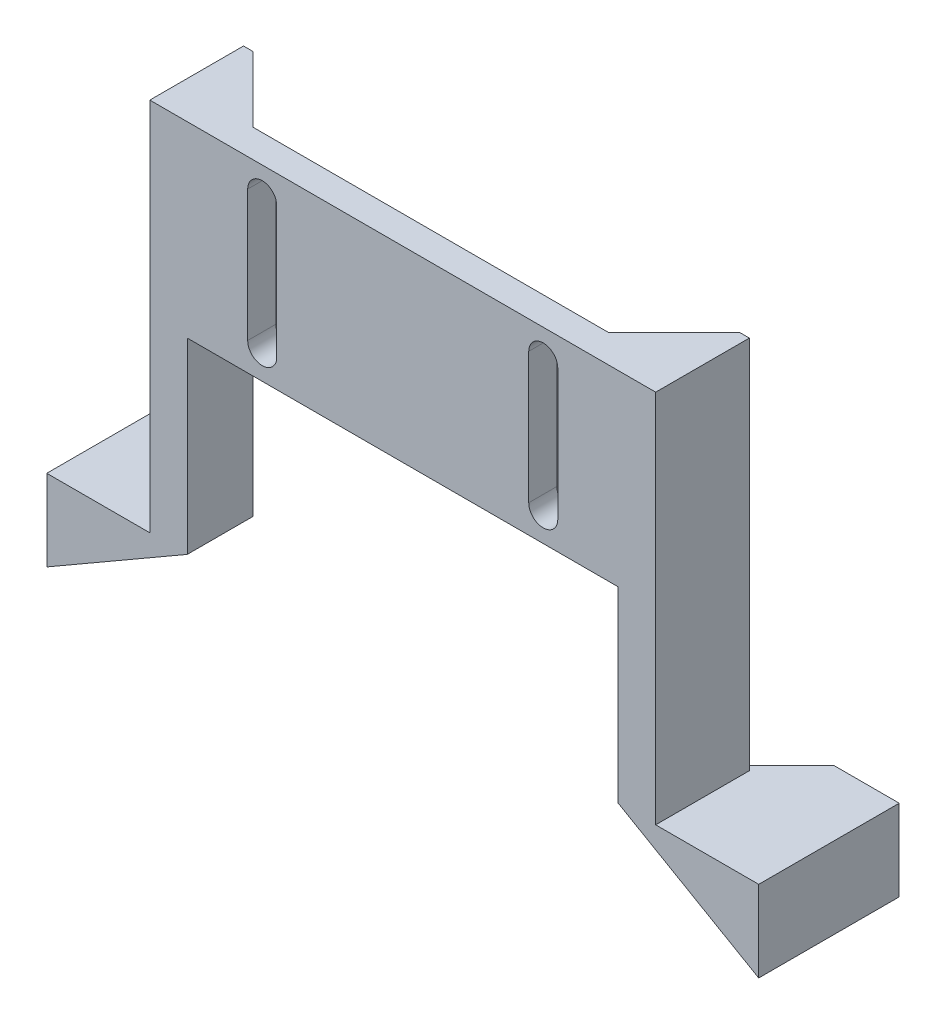
ISO-10303-21;
HEADER;
FILE_DESCRIPTION(('STEP AP214'),'2;1');
FILE_NAME('part.step','',(''),(''),'','','');
FILE_SCHEMA(('AUTOMOTIVE_DESIGN { 1 0 10303 214 1 1 1 1 }'));
ENDSEC;
DATA;
#1=APPLICATION_CONTEXT('core data for automotive mechanical design processes');
#2=APPLICATION_PROTOCOL_DEFINITION('international standard','automotive_design',2000,#1);
#3=PRODUCT_CONTEXT('',#1,'mechanical');
#4=PRODUCT('Part','Part','',(#3));
#5=PRODUCT_RELATED_PRODUCT_CATEGORY('part','',(#4));
#6=PRODUCT_DEFINITION_FORMATION('','',#4);
#7=PRODUCT_DEFINITION_CONTEXT('part definition',#1,'design');
#8=PRODUCT_DEFINITION('design','',#6,#7);
#9=PRODUCT_DEFINITION_SHAPE('','',#8);
#10=(LENGTH_UNIT() NAMED_UNIT(*) SI_UNIT(.MILLI.,.METRE.));
#11=(NAMED_UNIT(*) PLANE_ANGLE_UNIT() SI_UNIT($,.RADIAN.));
#12=(NAMED_UNIT(*) SI_UNIT($,.STERADIAN.) SOLID_ANGLE_UNIT());
#13=UNCERTAINTY_MEASURE_WITH_UNIT(LENGTH_MEASURE(1.E-05),#10,'distance_accuracy_value','');
#14=(GEOMETRIC_REPRESENTATION_CONTEXT(3) GLOBAL_UNCERTAINTY_ASSIGNED_CONTEXT((#13)) GLOBAL_UNIT_ASSIGNED_CONTEXT((#10,
#11,#12)) REPRESENTATION_CONTEXT('',''));
#15=CARTESIAN_POINT('',(0.,0.,0.));
#16=DIRECTION('',(0.,0.,1.));
#17=DIRECTION('',(1.,0.,0.));
#18=AXIS2_PLACEMENT_3D('',#15,#16,#17);
#19=CARTESIAN_POINT('',(-15.,-7.,10.));
#20=DIRECTION('',(0.,0.,-1.));
#21=DIRECTION('',(-1.,0.,0.));
#22=AXIS2_PLACEMENT_3D('',#19,#20,#21);
#23=CYLINDRICAL_SURFACE('',#22,1.55);
#24=DIRECTION('',(0.,0.,-1.));
#25=VECTOR('',#24,1.);
#26=CARTESIAN_POINT('',(-13.45,-7.,10.));
#27=LINE('',#26,#25);
#28=CARTESIAN_POINT('',(-13.45,-7.,10.));
#29=VERTEX_POINT('',#28);
#30=CARTESIAN_POINT('',(-13.45,-7.,7.));
#31=VERTEX_POINT('',#30);
#32=EDGE_CURVE('E348',#29,#31,#27,.T.);
#33=ORIENTED_EDGE('',*,*,#32,.T.);
#34=CARTESIAN_POINT('',(-15.,-7.,7.));
#35=DIRECTION('',(0.,0.,-1.));
#36=DIRECTION('',(-1.,0.,0.));
#37=AXIS2_PLACEMENT_3D('',#34,#35,#36);
#38=CIRCLE('',#37,1.55);
#39=CARTESIAN_POINT('',(-16.55,-7.,7.));
#40=VERTEX_POINT('',#39);
#41=EDGE_CURVE('E243',#31,#40,#38,.T.);
#42=ORIENTED_EDGE('',*,*,#41,.T.);
#43=DIRECTION('',(0.,0.,-1.));
#44=VECTOR('',#43,1.);
#45=CARTESIAN_POINT('',(-16.55,-7.,10.));
#46=LINE('',#45,#44);
#47=CARTESIAN_POINT('',(-16.55,-7.,10.));
#48=VERTEX_POINT('',#47);
#49=EDGE_CURVE('E358',#48,#40,#46,.T.);
#50=ORIENTED_EDGE('',*,*,#49,.F.);
#51=CARTESIAN_POINT('',(-15.,-7.,10.));
#52=DIRECTION('',(0.,0.,1.));
#53=DIRECTION('',(1.,0.,0.));
#54=AXIS2_PLACEMENT_3D('',#51,#52,#53);
#55=CIRCLE('',#54,1.55);
#56=EDGE_CURVE('E324',#48,#29,#55,.T.);
#57=ORIENTED_EDGE('',*,*,#56,.T.);
#58=EDGE_LOOP('',(#33,#42,#50,#57));
#59=FACE_BOUND('',#58,.T.);
#60=ADVANCED_FACE('F34',(#59),#23,.F.);
#61=CARTESIAN_POINT('',(-16.55,0.,10.));
#62=DIRECTION('',(1.,0.,0.));
#63=DIRECTION('',(0.,1.,0.));
#64=AXIS2_PLACEMENT_3D('',#61,#62,#63);
#65=PLANE('',#64);
#66=ORIENTED_EDGE('',*,*,#49,.T.);
#67=DIRECTION('',(0.,1.,0.));
#68=VECTOR('',#67,1.);
#69=CARTESIAN_POINT('',(-16.55,0.,7.));
#70=LINE('',#69,#68);
#71=CARTESIAN_POINT('',(-16.55,7.,7.));
#72=VERTEX_POINT('',#71);
#73=EDGE_CURVE('E240',#40,#72,#70,.T.);
#74=ORIENTED_EDGE('',*,*,#73,.T.);
#75=DIRECTION('',(0.,0.,-1.));
#76=VECTOR('',#75,1.);
#77=CARTESIAN_POINT('',(-16.55,7.,10.));
#78=LINE('',#77,#76);
#79=CARTESIAN_POINT('',(-16.55,7.,10.));
#80=VERTEX_POINT('',#79);
#81=EDGE_CURVE('E355',#80,#72,#78,.T.);
#82=ORIENTED_EDGE('',*,*,#81,.F.);
#83=DIRECTION('',(0.,-1.,0.));
#84=VECTOR('',#83,1.);
#85=CARTESIAN_POINT('',(-16.55,0.,10.));
#86=LINE('',#85,#84);
#87=EDGE_CURVE('E327',#80,#48,#86,.T.);
#88=ORIENTED_EDGE('',*,*,#87,.T.);
#89=EDGE_LOOP('',(#66,#74,#82,#88));
#90=FACE_BOUND('',#89,.T.);
#91=ADVANCED_FACE('F451',(#90),#65,.T.);
#92=CARTESIAN_POINT('',(-15.,7.,10.));
#93=DIRECTION('',(0.,0.,-1.));
#94=DIRECTION('',(-1.,0.,0.));
#95=AXIS2_PLACEMENT_3D('',#92,#93,#94);
#96=CYLINDRICAL_SURFACE('',#95,1.55);
#97=ORIENTED_EDGE('',*,*,#81,.T.);
#98=CARTESIAN_POINT('',(-15.,7.,7.));
#99=DIRECTION('',(0.,0.,-1.));
#100=DIRECTION('',(-1.,0.,0.));
#101=AXIS2_PLACEMENT_3D('',#98,#99,#100);
#102=CIRCLE('',#101,1.55);
#103=CARTESIAN_POINT('',(-13.45,7.,7.));
#104=VERTEX_POINT('',#103);
#105=EDGE_CURVE('E237',#72,#104,#102,.T.);
#106=ORIENTED_EDGE('',*,*,#105,.T.);
#107=DIRECTION('',(0.,0.,-1.));
#108=VECTOR('',#107,1.);
#109=CARTESIAN_POINT('',(-13.45,7.,10.));
#110=LINE('',#109,#108);
#111=CARTESIAN_POINT('',(-13.45,7.,10.));
#112=VERTEX_POINT('',#111);
#113=EDGE_CURVE('E351',#112,#104,#110,.T.);
#114=ORIENTED_EDGE('',*,*,#113,.F.);
#115=CARTESIAN_POINT('',(-15.,7.,10.));
#116=DIRECTION('',(0.,0.,1.));
#117=DIRECTION('',(1.,0.,0.));
#118=AXIS2_PLACEMENT_3D('',#115,#116,#117);
#119=CIRCLE('',#118,1.55);
#120=EDGE_CURVE('E330',#112,#80,#119,.T.);
#121=ORIENTED_EDGE('',*,*,#120,.T.);
#122=EDGE_LOOP('',(#97,#106,#114,#121));
#123=FACE_BOUND('',#122,.T.);
#124=ADVANCED_FACE('F457',(#123),#96,.F.);
#125=CARTESIAN_POINT('',(15.,-7.,10.));
#126=DIRECTION('',(0.,0.,-1.));
#127=DIRECTION('',(-1.,0.,0.));
#128=AXIS2_PLACEMENT_3D('',#125,#126,#127);
#129=CYLINDRICAL_SURFACE('',#128,1.55);
#130=DIRECTION('',(0.,0.,-1.));
#131=VECTOR('',#130,1.);
#132=CARTESIAN_POINT('',(16.55,-7.,10.));
#133=LINE('',#132,#131);
#134=CARTESIAN_POINT('',(16.55,-7.,10.));
#135=VERTEX_POINT('',#134);
#136=CARTESIAN_POINT('',(16.55,-7.,7.));
#137=VERTEX_POINT('',#136);
#138=EDGE_CURVE('E362',#135,#137,#133,.T.);
#139=ORIENTED_EDGE('',*,*,#138,.T.);
#140=CARTESIAN_POINT('',(15.,-7.,7.));
#141=DIRECTION('',(0.,0.,-1.));
#142=DIRECTION('',(-1.,0.,0.));
#143=AXIS2_PLACEMENT_3D('',#140,#141,#142);
#144=CIRCLE('',#143,1.55);
#145=CARTESIAN_POINT('',(13.45,-7.,7.));
#146=VERTEX_POINT('',#145);
#147=EDGE_CURVE('E254',#137,#146,#144,.T.);
#148=ORIENTED_EDGE('',*,*,#147,.T.);
#149=DIRECTION('',(0.,0.,-1.));
#150=VECTOR('',#149,1.);
#151=CARTESIAN_POINT('',(13.45,-7.,10.));
#152=LINE('',#151,#150);
#153=CARTESIAN_POINT('',(13.45,-7.,10.));
#154=VERTEX_POINT('',#153);
#155=EDGE_CURVE('E352',#154,#146,#152,.T.);
#156=ORIENTED_EDGE('',*,*,#155,.F.);
#157=CARTESIAN_POINT('',(15.,-7.,10.));
#158=DIRECTION('',(0.,0.,1.));
#159=DIRECTION('',(1.,0.,0.));
#160=AXIS2_PLACEMENT_3D('',#157,#158,#159);
#161=CIRCLE('',#160,1.55);
#162=EDGE_CURVE('E313',#154,#135,#161,.T.);
#163=ORIENTED_EDGE('',*,*,#162,.T.);
#164=EDGE_LOOP('',(#139,#148,#156,#163));
#165=FACE_BOUND('',#164,.T.);
#166=ADVANCED_FACE('F474',(#165),#129,.F.);
#167=CARTESIAN_POINT('',(13.45,0.,10.));
#168=DIRECTION('',(1.,0.,0.));
#169=DIRECTION('',(0.,1.,0.));
#170=AXIS2_PLACEMENT_3D('',#167,#168,#169);
#171=PLANE('',#170);
#172=ORIENTED_EDGE('',*,*,#155,.T.);
#173=DIRECTION('',(0.,1.,0.));
#174=VECTOR('',#173,1.);
#175=CARTESIAN_POINT('',(13.45,0.,7.));
#176=LINE('',#175,#174);
#177=CARTESIAN_POINT('',(13.45,7.,7.));
#178=VERTEX_POINT('',#177);
#179=EDGE_CURVE('E251',#146,#178,#176,.T.);
#180=ORIENTED_EDGE('',*,*,#179,.T.);
#181=DIRECTION('',(0.,0.,-1.));
#182=VECTOR('',#181,1.);
#183=CARTESIAN_POINT('',(13.45,7.,10.));
#184=LINE('',#183,#182);
#185=CARTESIAN_POINT('',(13.45,7.,10.));
#186=VERTEX_POINT('',#185);
#187=EDGE_CURVE('E369',#186,#178,#184,.T.);
#188=ORIENTED_EDGE('',*,*,#187,.F.);
#189=DIRECTION('',(0.,-1.,0.));
#190=VECTOR('',#189,1.);
#191=CARTESIAN_POINT('',(13.45,0.,10.));
#192=LINE('',#191,#190);
#193=EDGE_CURVE('E316',#186,#154,#192,.T.);
#194=ORIENTED_EDGE('',*,*,#193,.T.);
#195=EDGE_LOOP('',(#172,#180,#188,#194));
#196=FACE_BOUND('',#195,.T.);
#197=ADVANCED_FACE('F470',(#196),#171,.T.);
#198=CARTESIAN_POINT('',(15.,7.,10.));
#199=DIRECTION('',(0.,0.,-1.));
#200=DIRECTION('',(-1.,0.,0.));
#201=AXIS2_PLACEMENT_3D('',#198,#199,#200);
#202=CYLINDRICAL_SURFACE('',#201,1.55);
#203=ORIENTED_EDGE('',*,*,#187,.T.);
#204=CARTESIAN_POINT('',(15.,7.,7.));
#205=DIRECTION('',(0.,0.,-1.));
#206=DIRECTION('',(-1.,0.,0.));
#207=AXIS2_PLACEMENT_3D('',#204,#205,#206);
#208=CIRCLE('',#207,1.55);
#209=CARTESIAN_POINT('',(16.55,7.,7.));
#210=VERTEX_POINT('',#209);
#211=EDGE_CURVE('E248',#178,#210,#208,.T.);
#212=ORIENTED_EDGE('',*,*,#211,.T.);
#213=DIRECTION('',(0.,0.,-1.));
#214=VECTOR('',#213,1.);
#215=CARTESIAN_POINT('',(16.55,7.,10.));
#216=LINE('',#215,#214);
#217=CARTESIAN_POINT('',(16.55,7.,10.));
#218=VERTEX_POINT('',#217);
#219=EDGE_CURVE('E365',#218,#210,#216,.T.);
#220=ORIENTED_EDGE('',*,*,#219,.F.);
#221=CARTESIAN_POINT('',(15.,7.,10.));
#222=DIRECTION('',(0.,0.,1.));
#223=DIRECTION('',(1.,0.,0.));
#224=AXIS2_PLACEMENT_3D('',#221,#222,#223);
#225=CIRCLE('',#224,1.55);
#226=EDGE_CURVE('E319',#218,#186,#225,.T.);
#227=ORIENTED_EDGE('',*,*,#226,.T.);
#228=EDGE_LOOP('',(#203,#212,#220,#227));
#229=FACE_BOUND('',#228,.T.);
#230=ADVANCED_FACE('F466',(#229),#202,.F.);
#231=CARTESIAN_POINT('',(16.55,0.,10.));
#232=DIRECTION('',(1.,0.,0.));
#233=DIRECTION('',(0.,0.,-1.));
#234=AXIS2_PLACEMENT_3D('',#231,#232,#233);
#235=PLANE('',#234);
#236=DIRECTION('',(0.,1.,0.));
#237=VECTOR('',#236,1.);
#238=CARTESIAN_POINT('',(16.55,0.,7.));
#239=LINE('',#238,#237);
#240=EDGE_CURVE('E246',#137,#210,#239,.T.);
#241=ORIENTED_EDGE('',*,*,#240,.F.);
#242=ORIENTED_EDGE('',*,*,#138,.F.);
#243=DIRECTION('',(0.,-1.,0.));
#244=VECTOR('',#243,1.);
#245=CARTESIAN_POINT('',(16.55,0.,10.));
#246=LINE('',#245,#244);
#247=EDGE_CURVE('E322',#218,#135,#246,.T.);
#248=ORIENTED_EDGE('',*,*,#247,.F.);
#249=ORIENTED_EDGE('',*,*,#219,.T.);
#250=EDGE_LOOP('',(#241,#242,#248,#249));
#251=FACE_BOUND('',#250,.T.);
#252=ADVANCED_FACE('F462',(#251),#235,.F.);
#253=CARTESIAN_POINT('',(-13.45,0.,10.));
#254=DIRECTION('',(1.,0.,0.));
#255=DIRECTION('',(0.,1.,0.));
#256=AXIS2_PLACEMENT_3D('',#253,#254,#255);
#257=PLANE('',#256);
#258=DIRECTION('',(0.,1.,0.));
#259=VECTOR('',#258,1.);
#260=CARTESIAN_POINT('',(-13.45,0.,7.));
#261=LINE('',#260,#259);
#262=EDGE_CURVE('E361',#31,#104,#261,.T.);
#263=ORIENTED_EDGE('',*,*,#262,.F.);
#264=ORIENTED_EDGE('',*,*,#32,.F.);
#265=DIRECTION('',(0.,-1.,0.));
#266=VECTOR('',#265,1.);
#267=CARTESIAN_POINT('',(-13.45,0.,10.));
#268=LINE('',#267,#266);
#269=EDGE_CURVE('E333',#112,#29,#268,.T.);
#270=ORIENTED_EDGE('',*,*,#269,.F.);
#271=ORIENTED_EDGE('',*,*,#113,.T.);
#272=EDGE_LOOP('',(#263,#264,#270,#271));
#273=FACE_BOUND('',#272,.T.);
#274=ADVANCED_FACE('F465',(#273),#257,.F.);
#275=CARTESIAN_POINT('',(0.,0.,0.));
#276=DIRECTION('',(0.,0.,1.));
#277=DIRECTION('',(1.,0.,0.));
#278=AXIS2_PLACEMENT_3D('',#275,#276,#277);
#279=PLANE('',#278);
#280=DIRECTION('',(1.,0.,0.));
#281=VECTOR('',#280,1.);
#282=CARTESIAN_POINT('',(0.,-30.,0.));
#283=LINE('',#282,#281);
#284=CARTESIAN_POINT('',(26.,-30.,0.));
#285=VERTEX_POINT('',#284);
#286=CARTESIAN_POINT('',(27.,-30.,0.));
#287=VERTEX_POINT('',#286);
#288=EDGE_CURVE('E344',#285,#287,#283,.T.);
#289=ORIENTED_EDGE('',*,*,#288,.F.);
#290=DIRECTION('',(0.,1.,0.));
#291=VECTOR('',#290,1.);
#292=CARTESIAN_POINT('',(26.,0.,0.));
#293=LINE('',#292,#291);
#294=CARTESIAN_POINT('',(26.,10.,0.));
#295=VERTEX_POINT('',#294);
#296=EDGE_CURVE('E11',#285,#295,#293,.T.);
#297=ORIENTED_EDGE('',*,*,#296,.T.);
#298=DIRECTION('',(-1.,0.,0.));
#299=VECTOR('',#298,1.);
#300=CARTESIAN_POINT('',(0.,10.,0.));
#301=LINE('',#300,#299);
#302=CARTESIAN_POINT('',(27.,10.,0.));
#303=VERTEX_POINT('',#302);
#304=EDGE_CURVE('E336',#303,#295,#301,.T.);
#305=ORIENTED_EDGE('',*,*,#304,.F.);
#306=DIRECTION('',(0.,-1.,0.));
#307=VECTOR('',#306,1.);
#308=CARTESIAN_POINT('',(27.,0.,0.));
#309=LINE('',#308,#307);
#310=EDGE_CURVE('E300',#303,#287,#309,.T.);
#311=ORIENTED_EDGE('',*,*,#310,.T.);
#312=EDGE_LOOP('',(#289,#297,#305,#311));
#313=FACE_BOUND('',#312,.T.);
#314=ADVANCED_FACE('F420',(#313),#279,.F.);
#315=CARTESIAN_POINT('',(0.,10.,10.));
#316=DIRECTION('',(0.,-1.,0.));
#317=DIRECTION('',(0.,0.,-1.));
#318=AXIS2_PLACEMENT_3D('',#315,#316,#317);
#319=PLANE('',#318);
#320=DIRECTION('',(1.,0.,0.));
#321=VECTOR('',#320,1.);
#322=CARTESIAN_POINT('',(19.,10.,7.));
#323=LINE('',#322,#321);
#324=CARTESIAN_POINT('',(-19.,10.,7.));
#325=VERTEX_POINT('',#324);
#326=CARTESIAN_POINT('',(19.,10.,7.));
#327=VERTEX_POINT('',#326);
#328=EDGE_CURVE('E227',#325,#327,#323,.T.);
#329=ORIENTED_EDGE('',*,*,#328,.F.);
#330=DIRECTION('',(0.707106781186549,0.,0.707106781186546));
#331=VECTOR('',#330,1.);
#332=CARTESIAN_POINT('',(-19.,10.,7.00000000000001));
#333=LINE('',#332,#331);
#334=CARTESIAN_POINT('',(-26.,10.,0.));
#335=VERTEX_POINT('',#334);
#336=EDGE_CURVE('E396',#325,#335,#333,.F.);
#337=ORIENTED_EDGE('',*,*,#336,.T.);
#338=CARTESIAN_POINT('',(-27.,10.,0.));
#339=VERTEX_POINT('',#338);
#340=EDGE_CURVE('E295',#335,#339,#301,.T.);
#341=ORIENTED_EDGE('',*,*,#340,.T.);
#342=DIRECTION('',(0.,0.,-1.));
#343=VECTOR('',#342,1.);
#344=CARTESIAN_POINT('',(-27.,10.,10.));
#345=LINE('',#344,#343);
#346=CARTESIAN_POINT('',(-27.,10.,10.));
#347=VERTEX_POINT('',#346);
#348=EDGE_CURVE('E366',#347,#339,#345,.T.);
#349=ORIENTED_EDGE('',*,*,#348,.F.);
#350=DIRECTION('',(-1.,0.,0.));
#351=VECTOR('',#350,1.);
#352=CARTESIAN_POINT('',(0.,10.,10.));
#353=LINE('',#352,#351);
#354=CARTESIAN_POINT('',(27.,10.,10.));
#355=VERTEX_POINT('',#354);
#356=EDGE_CURVE('E296',#355,#347,#353,.T.);
#357=ORIENTED_EDGE('',*,*,#356,.F.);
#358=DIRECTION('',(0.,0.,-1.));
#359=VECTOR('',#358,1.);
#360=CARTESIAN_POINT('',(27.,10.,10.));
#361=LINE('',#360,#359);
#362=EDGE_CURVE('E335',#355,#303,#361,.T.);
#363=ORIENTED_EDGE('',*,*,#362,.T.);
#364=ORIENTED_EDGE('',*,*,#304,.T.);
#365=DIRECTION('',(0.707106781186549,0.,-0.707106781186546));
#366=VECTOR('',#365,1.);
#367=CARTESIAN_POINT('',(19.,10.,7.00000000000001));
#368=LINE('',#367,#366);
#369=EDGE_CURVE('E394',#295,#327,#368,.F.);
#370=ORIENTED_EDGE('',*,*,#369,.T.);
#371=EDGE_LOOP('',(#329,#337,#341,#349,#357,#363,#364,#370));
#372=FACE_BOUND('',#371,.T.);
#373=ADVANCED_FACE('F423',(#372),#319,.F.);
#374=CARTESIAN_POINT('',(-27.,0.,10.));
#375=DIRECTION('',(1.,0.,0.));
#376=DIRECTION('',(0.,1.,0.));
#377=AXIS2_PLACEMENT_3D('',#374,#375,#376);
#378=PLANE('',#377);
#379=DIRECTION('',(0.,-1.,0.));
#380=VECTOR('',#379,1.);
#381=CARTESIAN_POINT('',(-27.,0.,0.));
#382=LINE('',#381,#380);
#383=CARTESIAN_POINT('',(-27.,-30.,0.));
#384=VERTEX_POINT('',#383);
#385=EDGE_CURVE('E339',#339,#384,#382,.T.);
#386=ORIENTED_EDGE('',*,*,#385,.T.);
#387=DIRECTION('',(0.,0.,-1.));
#388=VECTOR('',#387,1.);
#389=CARTESIAN_POINT('',(-27.,-30.,10.));
#390=LINE('',#389,#388);
#391=CARTESIAN_POINT('',(-27.,-30.,10.));
#392=VERTEX_POINT('',#391);
#393=EDGE_CURVE('E388',#392,#384,#390,.T.);
#394=ORIENTED_EDGE('',*,*,#393,.F.);
#395=DIRECTION('',(0.,-1.,0.));
#396=VECTOR('',#395,1.);
#397=CARTESIAN_POINT('',(-27.,0.,10.));
#398=LINE('',#397,#396);
#399=EDGE_CURVE('E299',#347,#392,#398,.T.);
#400=ORIENTED_EDGE('',*,*,#399,.F.);
#401=ORIENTED_EDGE('',*,*,#348,.T.);
#402=EDGE_LOOP('',(#386,#394,#400,#401));
#403=FACE_BOUND('',#402,.T.);
#404=ADVANCED_FACE('F490',(#403),#378,.F.);
#405=CARTESIAN_POINT('',(-23.,0.,10.));
#406=DIRECTION('',(1.,0.,0.));
#407=DIRECTION('',(0.,1.,0.));
#408=AXIS2_PLACEMENT_3D('',#405,#406,#407);
#409=PLANE('',#408);
#410=DIRECTION('',(0.,0.,-1.));
#411=VECTOR('',#410,1.);
#412=CARTESIAN_POINT('',(-23.,-30.,10.));
#413=LINE('',#412,#411);
#414=CARTESIAN_POINT('',(-23.,-30.,10.));
#415=VERTEX_POINT('',#414);
#416=CARTESIAN_POINT('',(-23.,-30.,3.00000000000003));
#417=VERTEX_POINT('',#416);
#418=EDGE_CURVE('E385',#415,#417,#413,.T.);
#419=ORIENTED_EDGE('',*,*,#418,.T.);
#420=DIRECTION('',(0.,-1.,0.));
#421=VECTOR('',#420,1.);
#422=CARTESIAN_POINT('',(-23.,0.,3.00000000000002));
#423=LINE('',#422,#421);
#424=CARTESIAN_POINT('',(-23.,-10.,3.00000000000002));
#425=VERTEX_POINT('',#424);
#426=EDGE_CURVE('E217',#417,#425,#423,.F.);
#427=ORIENTED_EDGE('',*,*,#426,.T.);
#428=DIRECTION('',(0.,0.,-1.));
#429=VECTOR('',#428,1.);
#430=CARTESIAN_POINT('',(-23.,-10.,10.));
#431=LINE('',#430,#429);
#432=CARTESIAN_POINT('',(-23.,-10.,10.));
#433=VERTEX_POINT('',#432);
#434=EDGE_CURVE('E383',#433,#425,#431,.T.);
#435=ORIENTED_EDGE('',*,*,#434,.F.);
#436=DIRECTION('',(0.,-1.,0.));
#437=VECTOR('',#436,1.);
#438=CARTESIAN_POINT('',(-23.,0.,10.));
#439=LINE('',#438,#437);
#440=EDGE_CURVE('E303',#433,#415,#439,.T.);
#441=ORIENTED_EDGE('',*,*,#440,.T.);
#442=EDGE_LOOP('',(#419,#427,#435,#441));
#443=FACE_BOUND('',#442,.T.);
#444=ADVANCED_FACE('F487',(#443),#409,.T.);
#445=CARTESIAN_POINT('',(0.,-10.,10.));
#446=DIRECTION('',(0.,1.,0.));
#447=DIRECTION('',(0.,0.,1.));
#448=AXIS2_PLACEMENT_3D('',#445,#446,#447);
#449=PLANE('',#448);
#450=ORIENTED_EDGE('',*,*,#434,.T.);
#451=DIRECTION('',(-0.707106781186549,0.,-0.707106781186546));
#452=VECTOR('',#451,1.);
#453=CARTESIAN_POINT('',(-19.,-10.,7.00000000000001));
#454=LINE('',#453,#452);
#455=CARTESIAN_POINT('',(-19.,-10.,7.));
#456=VERTEX_POINT('',#455);
#457=EDGE_CURVE('E216',#425,#456,#454,.F.);
#458=ORIENTED_EDGE('',*,*,#457,.T.);
#459=DIRECTION('',(-1.,0.,0.));
#460=VECTOR('',#459,1.);
#461=CARTESIAN_POINT('',(19.,-10.,7.));
#462=LINE('',#461,#460);
#463=CARTESIAN_POINT('',(19.,-10.,7.));
#464=VERTEX_POINT('',#463);
#465=EDGE_CURVE('E224',#464,#456,#462,.T.);
#466=ORIENTED_EDGE('',*,*,#465,.F.);
#467=DIRECTION('',(-0.707106781186549,0.,0.707106781186546));
#468=VECTOR('',#467,1.);
#469=CARTESIAN_POINT('',(19.,-10.,7.));
#470=LINE('',#469,#468);
#471=CARTESIAN_POINT('',(23.,-10.,3.00000000000003));
#472=VERTEX_POINT('',#471);
#473=EDGE_CURVE('E206',#464,#472,#470,.F.);
#474=ORIENTED_EDGE('',*,*,#473,.T.);
#475=DIRECTION('',(0.,0.,-1.));
#476=VECTOR('',#475,1.);
#477=CARTESIAN_POINT('',(23.,-10.,10.));
#478=LINE('',#477,#476);
#479=CARTESIAN_POINT('',(23.,-10.,10.));
#480=VERTEX_POINT('',#479);
#481=EDGE_CURVE('E381',#480,#472,#478,.T.);
#482=ORIENTED_EDGE('',*,*,#481,.F.);
#483=DIRECTION('',(1.,0.,0.));
#484=VECTOR('',#483,1.);
#485=CARTESIAN_POINT('',(0.,-10.,10.));
#486=LINE('',#485,#484);
#487=EDGE_CURVE('E306',#433,#480,#486,.T.);
#488=ORIENTED_EDGE('',*,*,#487,.F.);
#489=EDGE_LOOP('',(#450,#458,#466,#474,#482,#488));
#490=FACE_BOUND('',#489,.T.);
#491=ADVANCED_FACE('F230',(#490),#449,.F.);
#492=CARTESIAN_POINT('',(23.,0.,10.));
#493=DIRECTION('',(-1.,0.,0.));
#494=DIRECTION('',(0.,0.,1.));
#495=AXIS2_PLACEMENT_3D('',#492,#493,#494);
#496=PLANE('',#495);
#497=ORIENTED_EDGE('',*,*,#481,.T.);
#498=DIRECTION('',(0.,1.,0.));
#499=VECTOR('',#498,1.);
#500=CARTESIAN_POINT('',(23.,0.,3.00000000000003));
#501=LINE('',#500,#499);
#502=CARTESIAN_POINT('',(23.,-30.,3.00000000000002));
#503=VERTEX_POINT('',#502);
#504=EDGE_CURVE('E211',#472,#503,#501,.F.);
#505=ORIENTED_EDGE('',*,*,#504,.T.);
#506=DIRECTION('',(0.,0.,-1.));
#507=VECTOR('',#506,1.);
#508=CARTESIAN_POINT('',(23.,-30.,10.));
#509=LINE('',#508,#507);
#510=CARTESIAN_POINT('',(23.,-30.,10.));
#511=VERTEX_POINT('',#510);
#512=EDGE_CURVE('E378',#511,#503,#509,.T.);
#513=ORIENTED_EDGE('',*,*,#512,.F.);
#514=DIRECTION('',(0.,1.,0.));
#515=VECTOR('',#514,1.);
#516=CARTESIAN_POINT('',(23.,0.,10.));
#517=LINE('',#516,#515);
#518=EDGE_CURVE('E308',#511,#480,#517,.T.);
#519=ORIENTED_EDGE('',*,*,#518,.T.);
#520=EDGE_LOOP('',(#497,#505,#513,#519));
#521=FACE_BOUND('',#520,.T.);
#522=ADVANCED_FACE('F481',(#521),#496,.T.);
#523=CARTESIAN_POINT('',(27.,0.,10.));
#524=DIRECTION('',(1.,0.,0.));
#525=DIRECTION('',(0.,1.,0.));
#526=AXIS2_PLACEMENT_3D('',#523,#524,#525);
#527=PLANE('',#526);
#528=ORIENTED_EDGE('',*,*,#310,.F.);
#529=ORIENTED_EDGE('',*,*,#362,.F.);
#530=DIRECTION('',(0.,-1.,0.));
#531=VECTOR('',#530,1.);
#532=CARTESIAN_POINT('',(27.,0.,10.));
#533=LINE('',#532,#531);
#534=CARTESIAN_POINT('',(27.,-30.,10.));
#535=VERTEX_POINT('',#534);
#536=EDGE_CURVE('E311',#355,#535,#533,.T.);
#537=ORIENTED_EDGE('',*,*,#536,.T.);
#538=DIRECTION('',(0.,0.,-1.));
#539=VECTOR('',#538,1.);
#540=CARTESIAN_POINT('',(27.,-30.,10.));
#541=LINE('',#540,#539);
#542=EDGE_CURVE('E375',#535,#287,#541,.T.);
#543=ORIENTED_EDGE('',*,*,#542,.T.);
#544=EDGE_LOOP('',(#528,#529,#537,#543));
#545=FACE_BOUND('',#544,.T.);
#546=ADVANCED_FACE('F428',(#545),#527,.T.);
#547=CARTESIAN_POINT('',(0.,0.,10.));
#548=DIRECTION('',(0.,0.,1.));
#549=DIRECTION('',(1.,0.,0.));
#550=AXIS2_PLACEMENT_3D('',#547,#548,#549);
#551=PLANE('',#550);
#552=ORIENTED_EDGE('',*,*,#356,.T.);
#553=ORIENTED_EDGE('',*,*,#399,.T.);
#554=DIRECTION('',(1.,0.,0.));
#555=VECTOR('',#554,1.);
#556=CARTESIAN_POINT('',(-38.,-30.,10.));
#557=LINE('',#556,#555);
#558=CARTESIAN_POINT('',(-38.,-30.,10.));
#559=VERTEX_POINT('',#558);
#560=EDGE_CURVE('E257',#559,#392,#557,.T.);
#561=ORIENTED_EDGE('',*,*,#560,.F.);
#562=DIRECTION('',(0.,1.,0.));
#563=VECTOR('',#562,1.);
#564=CARTESIAN_POINT('',(-38.,-38.6602540378443,10.));
#565=LINE('',#564,#563);
#566=CARTESIAN_POINT('',(-38.,-38.6602540378443,10.));
#567=VERTEX_POINT('',#566);
#568=EDGE_CURVE('E262',#567,#559,#565,.T.);
#569=ORIENTED_EDGE('',*,*,#568,.F.);
#570=DIRECTION('',(-0.866025403784442,-0.499999999999995,0.));
#571=VECTOR('',#570,1.);
#572=CARTESIAN_POINT('',(-23.,-30.,10.));
#573=LINE('',#572,#571);
#574=EDGE_CURVE('E259',#415,#567,#573,.T.);
#575=ORIENTED_EDGE('',*,*,#574,.F.);
#576=ORIENTED_EDGE('',*,*,#440,.F.);
#577=ORIENTED_EDGE('',*,*,#487,.T.);
#578=ORIENTED_EDGE('',*,*,#518,.F.);
#579=DIRECTION('',(-0.866025403784442,0.499999999999995,0.));
#580=VECTOR('',#579,1.);
#581=CARTESIAN_POINT('',(23.,-30.,10.));
#582=LINE('',#581,#580);
#583=CARTESIAN_POINT('',(38.,-38.6602540378443,10.));
#584=VERTEX_POINT('',#583);
#585=EDGE_CURVE('E281',#584,#511,#582,.T.);
#586=ORIENTED_EDGE('',*,*,#585,.F.);
#587=DIRECTION('',(0.,-1.,0.));
#588=VECTOR('',#587,1.);
#589=CARTESIAN_POINT('',(38.,-38.6602540378443,10.));
#590=LINE('',#589,#588);
#591=CARTESIAN_POINT('',(38.,-30.,10.));
#592=VERTEX_POINT('',#591);
#593=EDGE_CURVE('E278',#592,#584,#590,.T.);
#594=ORIENTED_EDGE('',*,*,#593,.F.);
#595=DIRECTION('',(1.,0.,0.));
#596=VECTOR('',#595,1.);
#597=CARTESIAN_POINT('',(38.,-30.,10.));
#598=LINE('',#597,#596);
#599=EDGE_CURVE('E276',#535,#592,#598,.T.);
#600=ORIENTED_EDGE('',*,*,#599,.F.);
#601=ORIENTED_EDGE('',*,*,#536,.F.);
#602=EDGE_LOOP('',(#552,#553,#561,#569,#575,#576,#577,#578,#586,#594,#600,#601));
#603=FACE_BOUND('',#602,.T.);
#604=ORIENTED_EDGE('',*,*,#162,.F.);
#605=ORIENTED_EDGE('',*,*,#193,.F.);
#606=ORIENTED_EDGE('',*,*,#226,.F.);
#607=ORIENTED_EDGE('',*,*,#247,.T.);
#608=EDGE_LOOP('',(#604,#605,#606,#607));
#609=FACE_BOUND('',#608,.T.);
#610=ORIENTED_EDGE('',*,*,#56,.F.);
#611=ORIENTED_EDGE('',*,*,#87,.F.);
#612=ORIENTED_EDGE('',*,*,#120,.F.);
#613=ORIENTED_EDGE('',*,*,#269,.T.);
#614=EDGE_LOOP('',(#610,#611,#612,#613));
#615=FACE_BOUND('',#614,.T.);
#616=ADVANCED_FACE('F435',(#603,#609,#615),#551,.T.);
#617=ORIENTED_EDGE('',*,*,#340,.F.);
#618=DIRECTION('',(0.,-1.,0.));
#619=VECTOR('',#618,1.);
#620=CARTESIAN_POINT('',(-26.,0.,0.));
#621=LINE('',#620,#619);
#622=CARTESIAN_POINT('',(-26.,-30.,0.));
#623=VERTEX_POINT('',#622);
#624=EDGE_CURVE('E398',#335,#623,#621,.T.);
#625=ORIENTED_EDGE('',*,*,#624,.T.);
#626=DIRECTION('',(-1.,0.,0.));
#627=VECTOR('',#626,1.);
#628=CARTESIAN_POINT('',(0.,-29.9999999999999,0.));
#629=LINE('',#628,#627);
#630=EDGE_CURVE('E342',#623,#384,#629,.T.);
#631=ORIENTED_EDGE('',*,*,#630,.T.);
#632=ORIENTED_EDGE('',*,*,#385,.F.);
#633=EDGE_LOOP('',(#617,#625,#631,#632));
#634=FACE_BOUND('',#633,.T.);
#635=ADVANCED_FACE('F448',(#634),#279,.F.);
#636=CARTESIAN_POINT('',(38.,-30.,-5.));
#637=DIRECTION('',(0.,-1.,0.));
#638=DIRECTION('',(0.,0.,-1.));
#639=AXIS2_PLACEMENT_3D('',#636,#637,#638);
#640=PLANE('',#639);
#641=DIRECTION('',(1.,0.,0.));
#642=VECTOR('',#641,1.);
#643=CARTESIAN_POINT('',(38.,-30.,-5.));
#644=LINE('',#643,#642);
#645=CARTESIAN_POINT('',(31.0000000000001,-30.,-5.));
#646=VERTEX_POINT('',#645);
#647=CARTESIAN_POINT('',(38.,-30.,-5.));
#648=VERTEX_POINT('',#647);
#649=EDGE_CURVE('E284',#646,#648,#644,.T.);
#650=ORIENTED_EDGE('',*,*,#649,.F.);
#651=DIRECTION('',(0.707106781186549,0.,-0.707106781186546));
#652=VECTOR('',#651,1.);
#653=CARTESIAN_POINT('',(19.,-30.,7.));
#654=LINE('',#653,#652);
#655=EDGE_CURVE('E42',#646,#285,#654,.F.);
#656=ORIENTED_EDGE('',*,*,#655,.T.);
#657=ORIENTED_EDGE('',*,*,#288,.T.);
#658=ORIENTED_EDGE('',*,*,#542,.F.);
#659=ORIENTED_EDGE('',*,*,#599,.T.);
#660=DIRECTION('',(0.,0.,1.));
#661=VECTOR('',#660,1.);
#662=CARTESIAN_POINT('',(38.,-30.,-5.));
#663=LINE('',#662,#661);
#664=EDGE_CURVE('E292',#648,#592,#663,.T.);
#665=ORIENTED_EDGE('',*,*,#664,.F.);
#666=EDGE_LOOP('',(#650,#656,#657,#658,#659,#665));
#667=FACE_BOUND('',#666,.T.);
#668=ADVANCED_FACE('F431',(#667),#640,.F.);
#669=CARTESIAN_POINT('',(38.,-38.6602540378443,-5.));
#670=DIRECTION('',(-1.,0.,0.));
#671=DIRECTION('',(0.,-1.,0.));
#672=AXIS2_PLACEMENT_3D('',#669,#670,#671);
#673=PLANE('',#672);
#674=ORIENTED_EDGE('',*,*,#664,.T.);
#675=ORIENTED_EDGE('',*,*,#593,.T.);
#676=DIRECTION('',(0.,0.,1.));
#677=VECTOR('',#676,1.);
#678=CARTESIAN_POINT('',(38.,-38.6602540378443,-5.));
#679=LINE('',#678,#677);
#680=CARTESIAN_POINT('',(38.,-38.6602540378443,-5.));
#681=VERTEX_POINT('',#680);
#682=EDGE_CURVE('E290',#681,#584,#679,.T.);
#683=ORIENTED_EDGE('',*,*,#682,.F.);
#684=DIRECTION('',(0.,-1.,0.));
#685=VECTOR('',#684,1.);
#686=CARTESIAN_POINT('',(38.,-38.6602540378443,-5.));
#687=LINE('',#686,#685);
#688=EDGE_CURVE('E286',#648,#681,#687,.T.);
#689=ORIENTED_EDGE('',*,*,#688,.F.);
#690=EDGE_LOOP('',(#674,#675,#683,#689));
#691=FACE_BOUND('',#690,.T.);
#692=ADVANCED_FACE('F440',(#691),#673,.F.);
#693=CARTESIAN_POINT('',(23.,-30.,-5.));
#694=DIRECTION('',(0.499999999999995,0.866025403784442,0.));
#695=DIRECTION('',(-0.866025403784442,0.499999999999995,0.));
#696=AXIS2_PLACEMENT_3D('',#693,#694,#695);
#697=PLANE('',#696);
#698=ORIENTED_EDGE('',*,*,#512,.T.);
#699=DIRECTION('',(-0.65465367070798,0.377964473009223,0.654653670707977));
#700=VECTOR('',#699,1.);
#701=CARTESIAN_POINT('',(9.67399538532077,-22.3062276484928,16.3260046146792));
#702=LINE('',#701,#700);
#703=CARTESIAN_POINT('',(31.0000000000001,-34.618802153517,-5.));
#704=VERTEX_POINT('',#703);
#705=EDGE_CURVE('E409',#503,#704,#702,.F.);
#706=ORIENTED_EDGE('',*,*,#705,.T.);
#707=DIRECTION('',(-0.866025403784442,0.499999999999995,0.));
#708=VECTOR('',#707,1.);
#709=CARTESIAN_POINT('',(23.,-30.,-5.));
#710=LINE('',#709,#708);
#711=EDGE_CURVE('E288',#681,#704,#710,.T.);
#712=ORIENTED_EDGE('',*,*,#711,.F.);
#713=ORIENTED_EDGE('',*,*,#682,.T.);
#714=ORIENTED_EDGE('',*,*,#585,.T.);
#715=EDGE_LOOP('',(#698,#706,#712,#713,#714));
#716=FACE_BOUND('',#715,.T.);
#717=ADVANCED_FACE('F413',(#716),#697,.F.);
#718=CARTESIAN_POINT('',(0.,0.,-5.));
#719=DIRECTION('',(0.,0.,-1.));
#720=DIRECTION('',(-1.,0.,0.));
#721=AXIS2_PLACEMENT_3D('',#718,#719,#720);
#722=PLANE('',#721);
#723=ORIENTED_EDGE('',*,*,#711,.T.);
#724=DIRECTION('',(0.,-1.,0.));
#725=VECTOR('',#724,1.);
#726=CARTESIAN_POINT('',(31.0000000000001,0.,-5.));
#727=LINE('',#726,#725);
#728=EDGE_CURVE('E56',#704,#646,#727,.F.);
#729=ORIENTED_EDGE('',*,*,#728,.T.);
#730=ORIENTED_EDGE('',*,*,#649,.T.);
#731=ORIENTED_EDGE('',*,*,#688,.T.);
#732=EDGE_LOOP('',(#723,#729,#730,#731));
#733=FACE_BOUND('',#732,.T.);
#734=ADVANCED_FACE('F414',(#733),#722,.T.);
#735=CARTESIAN_POINT('',(-38.,-30.,-5.));
#736=DIRECTION('',(0.,-1.,0.));
#737=DIRECTION('',(1.,0.,0.));
#738=AXIS2_PLACEMENT_3D('',#735,#736,#737);
#739=PLANE('',#738);
#740=ORIENTED_EDGE('',*,*,#630,.F.);
#741=DIRECTION('',(0.707106781186549,0.,0.707106781186546));
#742=VECTOR('',#741,1.);
#743=CARTESIAN_POINT('',(-19.,-30.,7.));
#744=LINE('',#743,#742);
#745=CARTESIAN_POINT('',(-31.,-30.,-5.));
#746=VERTEX_POINT('',#745);
#747=EDGE_CURVE('E400',#623,#746,#744,.F.);
#748=ORIENTED_EDGE('',*,*,#747,.T.);
#749=DIRECTION('',(1.,0.,0.));
#750=VECTOR('',#749,1.);
#751=CARTESIAN_POINT('',(-38.,-30.,-5.));
#752=LINE('',#751,#750);
#753=CARTESIAN_POINT('',(-38.,-30.,-5.));
#754=VERTEX_POINT('',#753);
#755=EDGE_CURVE('E265',#754,#746,#752,.T.);
#756=ORIENTED_EDGE('',*,*,#755,.F.);
#757=DIRECTION('',(0.,0.,1.));
#758=VECTOR('',#757,1.);
#759=CARTESIAN_POINT('',(-38.,-30.,-5.));
#760=LINE('',#759,#758);
#761=EDGE_CURVE('E272',#754,#559,#760,.T.);
#762=ORIENTED_EDGE('',*,*,#761,.T.);
#763=ORIENTED_EDGE('',*,*,#560,.T.);
#764=ORIENTED_EDGE('',*,*,#393,.T.);
#765=EDGE_LOOP('',(#740,#748,#756,#762,#763,#764));
#766=FACE_BOUND('',#765,.T.);
#767=ADVANCED_FACE('F513',(#766),#739,.F.);
#768=CARTESIAN_POINT('',(-23.,-30.,-5.));
#769=DIRECTION('',(-0.499999999999995,0.866025403784442,0.));
#770=DIRECTION('',(-0.866025403784442,-0.499999999999995,0.));
#771=AXIS2_PLACEMENT_3D('',#768,#769,#770);
#772=PLANE('',#771);
#773=DIRECTION('',(-0.866025403784442,-0.499999999999995,0.));
#774=VECTOR('',#773,1.);
#775=CARTESIAN_POINT('',(-23.,-30.,-5.));
#776=LINE('',#775,#774);
#777=CARTESIAN_POINT('',(-31.,-34.618802153517,-5.));
#778=VERTEX_POINT('',#777);
#779=CARTESIAN_POINT('',(-38.,-38.6602540378443,-5.));
#780=VERTEX_POINT('',#779);
#781=EDGE_CURVE('E268',#778,#780,#776,.T.);
#782=ORIENTED_EDGE('',*,*,#781,.F.);
#783=DIRECTION('',(-0.65465367070798,-0.377964473009223,-0.654653670707977));
#784=VECTOR('',#783,1.);
#785=CARTESIAN_POINT('',(-9.67399538532075,-22.3062276484928,16.3260046146792));
#786=LINE('',#785,#784);
#787=EDGE_CURVE('E404',#778,#417,#786,.F.);
#788=ORIENTED_EDGE('',*,*,#787,.T.);
#789=ORIENTED_EDGE('',*,*,#418,.F.);
#790=ORIENTED_EDGE('',*,*,#574,.T.);
#791=DIRECTION('',(0.,0.,1.));
#792=VECTOR('',#791,1.);
#793=CARTESIAN_POINT('',(-38.,-38.6602540378443,-5.));
#794=LINE('',#793,#792);
#795=EDGE_CURVE('E274',#780,#567,#794,.T.);
#796=ORIENTED_EDGE('',*,*,#795,.F.);
#797=EDGE_LOOP('',(#782,#788,#789,#790,#796));
#798=FACE_BOUND('',#797,.T.);
#799=ADVANCED_FACE('F532',(#798),#772,.F.);
#800=CARTESIAN_POINT('',(-38.,-38.6602540378443,-5.));
#801=DIRECTION('',(1.,0.,0.));
#802=DIRECTION('',(0.,0.,-1.));
#803=AXIS2_PLACEMENT_3D('',#800,#801,#802);
#804=PLANE('',#803);
#805=ORIENTED_EDGE('',*,*,#795,.T.);
#806=ORIENTED_EDGE('',*,*,#568,.T.);
#807=ORIENTED_EDGE('',*,*,#761,.F.);
#808=DIRECTION('',(0.,1.,0.));
#809=VECTOR('',#808,1.);
#810=CARTESIAN_POINT('',(-38.,-38.6602540378443,-5.));
#811=LINE('',#810,#809);
#812=EDGE_CURVE('E270',#780,#754,#811,.T.);
#813=ORIENTED_EDGE('',*,*,#812,.F.);
#814=EDGE_LOOP('',(#805,#806,#807,#813));
#815=FACE_BOUND('',#814,.T.);
#816=ADVANCED_FACE('F520',(#815),#804,.F.);
#817=CARTESIAN_POINT('',(0.,0.,-5.));
#818=DIRECTION('',(0.,0.,1.));
#819=DIRECTION('',(1.,0.,0.));
#820=AXIS2_PLACEMENT_3D('',#817,#818,#819);
#821=PLANE('',#820);
#822=ORIENTED_EDGE('',*,*,#755,.T.);
#823=DIRECTION('',(0.,1.,0.));
#824=VECTOR('',#823,1.);
#825=CARTESIAN_POINT('',(-31.,10.,-5.));
#826=LINE('',#825,#824);
#827=EDGE_CURVE('E402',#746,#778,#826,.F.);
#828=ORIENTED_EDGE('',*,*,#827,.T.);
#829=ORIENTED_EDGE('',*,*,#781,.T.);
#830=ORIENTED_EDGE('',*,*,#812,.T.);
#831=EDGE_LOOP('',(#822,#828,#829,#830));
#832=FACE_BOUND('',#831,.T.);
#833=ADVANCED_FACE('F503',(#832),#821,.F.);
#834=CARTESIAN_POINT('',(0.,0.,7.));
#835=DIRECTION('',(0.,0.,-1.));
#836=DIRECTION('',(-1.,0.,0.));
#837=AXIS2_PLACEMENT_3D('',#834,#835,#836);
#838=PLANE('',#837);
#839=ORIENTED_EDGE('',*,*,#240,.T.);
#840=ORIENTED_EDGE('',*,*,#211,.F.);
#841=ORIENTED_EDGE('',*,*,#179,.F.);
#842=ORIENTED_EDGE('',*,*,#147,.F.);
#843=EDGE_LOOP('',(#839,#840,#841,#842));
#844=FACE_BOUND('',#843,.T.);
#845=ORIENTED_EDGE('',*,*,#262,.T.);
#846=ORIENTED_EDGE('',*,*,#105,.F.);
#847=ORIENTED_EDGE('',*,*,#73,.F.);
#848=ORIENTED_EDGE('',*,*,#41,.F.);
#849=EDGE_LOOP('',(#845,#846,#847,#848));
#850=FACE_BOUND('',#849,.T.);
#851=DIRECTION('',(0.,-1.,0.));
#852=VECTOR('',#851,1.);
#853=CARTESIAN_POINT('',(19.,10.,7.));
#854=LINE('',#853,#852);
#855=EDGE_CURVE('E209',#327,#464,#854,.T.);
#856=ORIENTED_EDGE('',*,*,#855,.T.);
#857=ORIENTED_EDGE('',*,*,#465,.T.);
#858=DIRECTION('',(0.,1.,0.));
#859=VECTOR('',#858,1.);
#860=CARTESIAN_POINT('',(-19.,10.,7.));
#861=LINE('',#860,#859);
#862=EDGE_CURVE('E232',#456,#325,#861,.T.);
#863=ORIENTED_EDGE('',*,*,#862,.T.);
#864=ORIENTED_EDGE('',*,*,#328,.T.);
#865=EDGE_LOOP('',(#856,#857,#863,#864));
#866=FACE_BOUND('',#865,.T.);
#867=ADVANCED_FACE('F222',(#844,#850,#866),#838,.T.);
#868=CARTESIAN_POINT('',(-19.,10.,7.00000000000001));
#869=DIRECTION('',(-0.707106781186546,0.,0.707106781186549));
#870=DIRECTION('',(0.,1.,0.));
#871=AXIS2_PLACEMENT_3D('',#868,#869,#870);
#872=PLANE('',#871);
#873=ORIENTED_EDGE('',*,*,#747,.F.);
#874=ORIENTED_EDGE('',*,*,#624,.F.);
#875=ORIENTED_EDGE('',*,*,#336,.F.);
#876=ORIENTED_EDGE('',*,*,#862,.F.);
#877=ORIENTED_EDGE('',*,*,#457,.F.);
#878=ORIENTED_EDGE('',*,*,#426,.F.);
#879=ORIENTED_EDGE('',*,*,#787,.F.);
#880=ORIENTED_EDGE('',*,*,#827,.F.);
#881=EDGE_LOOP('',(#873,#874,#875,#876,#877,#878,#879,#880));
#882=FACE_BOUND('',#881,.T.);
#883=ADVANCED_FACE('F496',(#882),#872,.F.);
#884=CARTESIAN_POINT('',(19.,10.,7.00000000000001));
#885=DIRECTION('',(0.707106781186546,0.,0.707106781186549));
#886=DIRECTION('',(0.,-1.,0.));
#887=AXIS2_PLACEMENT_3D('',#884,#885,#886);
#888=PLANE('',#887);
#889=ORIENTED_EDGE('',*,*,#369,.F.);
#890=ORIENTED_EDGE('',*,*,#296,.F.);
#891=ORIENTED_EDGE('',*,*,#655,.F.);
#892=ORIENTED_EDGE('',*,*,#728,.F.);
#893=ORIENTED_EDGE('',*,*,#705,.F.);
#894=ORIENTED_EDGE('',*,*,#504,.F.);
#895=ORIENTED_EDGE('',*,*,#473,.F.);
#896=ORIENTED_EDGE('',*,*,#855,.F.);
#897=EDGE_LOOP('',(#889,#890,#891,#892,#893,#894,#895,#896));
#898=FACE_BOUND('',#897,.T.);
#899=ADVANCED_FACE('F36',(#898),#888,.F.);
#900=CLOSED_SHELL('',(#60,#91,#124,#166,#197,#230,#252,#274,#314,#373,#404,#444,#491,#522,#546,
#616,#635,#668,#692,#717,#734,#767,#799,#816,#833,#867,#883,#899));
#901=MANIFOLD_SOLID_BREP('B2',#900);
#902=ADVANCED_BREP_SHAPE_REPRESENTATION('',(#18,#901),#14);
#903=SHAPE_DEFINITION_REPRESENTATION(#9,#902);
ENDSEC;
END-ISO-10303-21;
